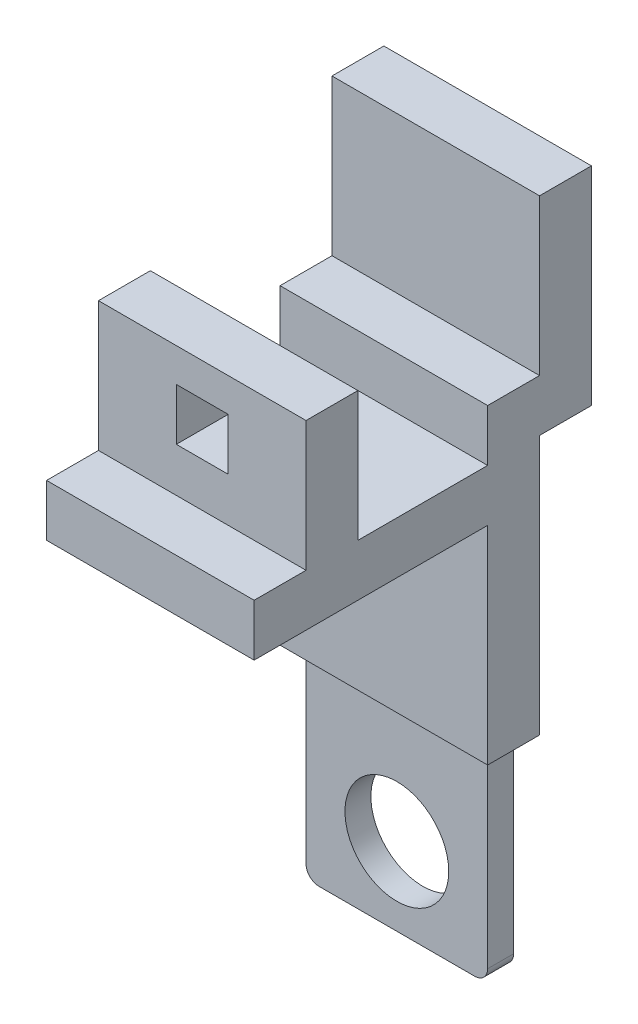
ISO-10303-21;
HEADER;
FILE_DESCRIPTION(('STEP AP214'),'2;1');
FILE_NAME('part.step','',(''),(''),'','','');
FILE_SCHEMA(('AUTOMOTIVE_DESIGN { 1 0 10303 214 1 1 1 1 }'));
ENDSEC;
DATA;
#1=APPLICATION_CONTEXT('core data for automotive mechanical design processes');
#2=APPLICATION_PROTOCOL_DEFINITION('international standard','automotive_design',2000,#1);
#3=PRODUCT_CONTEXT('',#1,'mechanical');
#4=PRODUCT('Part','Part','',(#3));
#5=PRODUCT_RELATED_PRODUCT_CATEGORY('part','',(#4));
#6=PRODUCT_DEFINITION_FORMATION('','',#4);
#7=PRODUCT_DEFINITION_CONTEXT('part definition',#1,'design');
#8=PRODUCT_DEFINITION('design','',#6,#7);
#9=PRODUCT_DEFINITION_SHAPE('','',#8);
#10=(LENGTH_UNIT() NAMED_UNIT(*) SI_UNIT(.MILLI.,.METRE.));
#11=(NAMED_UNIT(*) PLANE_ANGLE_UNIT() SI_UNIT($,.RADIAN.));
#12=(NAMED_UNIT(*) SI_UNIT($,.STERADIAN.) SOLID_ANGLE_UNIT());
#13=UNCERTAINTY_MEASURE_WITH_UNIT(LENGTH_MEASURE(1.E-05),#10,'distance_accuracy_value','');
#14=(GEOMETRIC_REPRESENTATION_CONTEXT(3) GLOBAL_UNCERTAINTY_ASSIGNED_CONTEXT((#13)) GLOBAL_UNIT_ASSIGNED_CONTEXT((#10,
#11,#12)) REPRESENTATION_CONTEXT('',''));
#15=CARTESIAN_POINT('',(0.,0.,0.));
#16=DIRECTION('',(0.,0.,1.));
#17=DIRECTION('',(1.,0.,0.));
#18=AXIS2_PLACEMENT_3D('',#15,#16,#17);
#19=CARTESIAN_POINT('',(0.,5.,0.));
#20=DIRECTION('',(0.,-1.,0.));
#21=DIRECTION('',(0.,0.,-1.));
#22=AXIS2_PLACEMENT_3D('',#19,#20,#21);
#23=PLANE('',#22);
#24=DIRECTION('',(1.,0.,0.));
#25=VECTOR('',#24,1.);
#26=CARTESIAN_POINT('',(-2.,5.,4.));
#27=LINE('',#26,#25);
#28=CARTESIAN_POINT('',(-2.,5.,4.));
#29=VERTEX_POINT('',#28);
#30=CARTESIAN_POINT('',(2.,5.,4.));
#31=VERTEX_POINT('',#30);
#32=EDGE_CURVE('E268',#29,#31,#27,.T.);
#33=ORIENTED_EDGE('',*,*,#32,.F.);
#34=DIRECTION('',(0.,0.,-1.));
#35=VECTOR('',#34,1.);
#36=CARTESIAN_POINT('',(-2.,5.,0.5));
#37=LINE('',#36,#35);
#38=CARTESIAN_POINT('',(-2.,5.,5.));
#39=VERTEX_POINT('',#38);
#40=EDGE_CURVE('E365',#39,#29,#37,.T.);
#41=ORIENTED_EDGE('',*,*,#40,.F.);
#42=DIRECTION('',(-1.,0.,0.));
#43=VECTOR('',#42,1.);
#44=CARTESIAN_POINT('',(2.,5.,5.));
#45=LINE('',#44,#43);
#46=CARTESIAN_POINT('',(2.,5.,5.));
#47=VERTEX_POINT('',#46);
#48=EDGE_CURVE('E349',#47,#39,#45,.T.);
#49=ORIENTED_EDGE('',*,*,#48,.F.);
#50=DIRECTION('',(0.,0.,-1.));
#51=VECTOR('',#50,1.);
#52=CARTESIAN_POINT('',(2.,5.,0.5));
#53=LINE('',#52,#51);
#54=EDGE_CURVE('E370',#47,#31,#53,.T.);
#55=ORIENTED_EDGE('',*,*,#54,.T.);
#56=EDGE_LOOP('',(#33,#41,#49,#55));
#57=FACE_BOUND('',#56,.T.);
#58=ADVANCED_FACE('F32',(#57),#23,.F.);
#59=DIRECTION('',(-1.,0.,0.));
#60=VECTOR('',#59,1.);
#61=CARTESIAN_POINT('',(-2.,5.,3.));
#62=LINE('',#61,#60);
#63=CARTESIAN_POINT('',(2.,5.,3.));
#64=VERTEX_POINT('',#63);
#65=CARTESIAN_POINT('',(-2.,5.,3.));
#66=VERTEX_POINT('',#65);
#67=EDGE_CURVE('E273',#64,#66,#62,.T.);
#68=ORIENTED_EDGE('',*,*,#67,.F.);
#69=CARTESIAN_POINT('',(2.,5.,0.5));
#70=VERTEX_POINT('',#69);
#71=EDGE_CURVE('E368',#64,#70,#53,.T.);
#72=ORIENTED_EDGE('',*,*,#71,.T.);
#73=DIRECTION('',(1.,0.,0.));
#74=VECTOR('',#73,1.);
#75=CARTESIAN_POINT('',(-2.,5.,0.5));
#76=LINE('',#75,#74);
#77=CARTESIAN_POINT('',(-2.,5.,0.5));
#78=VERTEX_POINT('',#77);
#79=EDGE_CURVE('E330',#78,#70,#76,.T.);
#80=ORIENTED_EDGE('',*,*,#79,.F.);
#81=EDGE_CURVE('E369',#66,#78,#37,.T.);
#82=ORIENTED_EDGE('',*,*,#81,.F.);
#83=EDGE_LOOP('',(#68,#72,#80,#82));
#84=FACE_BOUND('',#83,.T.);
#85=ADVANCED_FACE('F485',(#84),#23,.F.);
#86=CARTESIAN_POINT('',(-2.,5.,0.5));
#87=DIRECTION('',(0.,0.,-1.));
#88=DIRECTION('',(-1.,0.,0.));
#89=AXIS2_PLACEMENT_3D('',#86,#87,#88);
#90=PLANE('',#89);
#91=DIRECTION('',(1.,0.,0.));
#92=VECTOR('',#91,1.);
#93=CARTESIAN_POINT('',(2.,4.,0.5));
#94=LINE('',#93,#92);
#95=CARTESIAN_POINT('',(-2.,4.,0.5));
#96=VERTEX_POINT('',#95);
#97=CARTESIAN_POINT('',(2.,4.,0.5));
#98=VERTEX_POINT('',#97);
#99=EDGE_CURVE('E345',#96,#98,#94,.T.);
#100=ORIENTED_EDGE('',*,*,#99,.F.);
#101=DIRECTION('',(0.,-1.,0.));
#102=VECTOR('',#101,1.);
#103=CARTESIAN_POINT('',(-2.,5.,0.5));
#104=LINE('',#103,#102);
#105=CARTESIAN_POINT('',(-2.,0.,0.5));
#106=VERTEX_POINT('',#105);
#107=EDGE_CURVE('E384',#96,#106,#104,.T.);
#108=ORIENTED_EDGE('',*,*,#107,.T.);
#109=DIRECTION('',(1.,0.,0.));
#110=VECTOR('',#109,1.);
#111=CARTESIAN_POINT('',(-2.,0.,0.5));
#112=LINE('',#111,#110);
#113=CARTESIAN_POINT('',(2.,0.,0.5));
#114=VERTEX_POINT('',#113);
#115=EDGE_CURVE('E381',#106,#114,#112,.T.);
#116=ORIENTED_EDGE('',*,*,#115,.T.);
#117=DIRECTION('',(0.,-1.,0.));
#118=VECTOR('',#117,1.);
#119=CARTESIAN_POINT('',(2.,5.,0.5));
#120=LINE('',#119,#118);
#121=EDGE_CURVE('E387',#98,#114,#120,.T.);
#122=ORIENTED_EDGE('',*,*,#121,.F.);
#123=EDGE_LOOP('',(#100,#108,#116,#122));
#124=FACE_BOUND('',#123,.T.);
#125=ADVANCED_FACE('F491',(#124),#90,.F.);
#126=CARTESIAN_POINT('',(-2.,5.,0.5));
#127=DIRECTION('',(-1.,0.,0.));
#128=DIRECTION('',(0.,0.,1.));
#129=AXIS2_PLACEMENT_3D('',#126,#127,#128);
#130=PLANE('',#129);
#131=DIRECTION('',(0.,0.,-1.));
#132=VECTOR('',#131,1.);
#133=CARTESIAN_POINT('',(-2.,0.,0.5));
#134=LINE('',#133,#132);
#135=CARTESIAN_POINT('',(-2.,0.,-0.5));
#136=VERTEX_POINT('',#135);
#137=EDGE_CURVE('E364',#106,#136,#134,.T.);
#138=ORIENTED_EDGE('',*,*,#137,.F.);
#139=ORIENTED_EDGE('',*,*,#107,.F.);
#140=DIRECTION('',(0.,0.,-1.));
#141=VECTOR('',#140,1.);
#142=CARTESIAN_POINT('',(-2.,4.,5.));
#143=LINE('',#142,#141);
#144=CARTESIAN_POINT('',(-2.,4.,5.));
#145=VERTEX_POINT('',#144);
#146=EDGE_CURVE('E361',#145,#96,#143,.T.);
#147=ORIENTED_EDGE('',*,*,#146,.F.);
#148=DIRECTION('',(0.,-1.,0.));
#149=VECTOR('',#148,1.);
#150=CARTESIAN_POINT('',(-2.,5.,5.));
#151=LINE('',#150,#149);
#152=EDGE_CURVE('E352',#39,#145,#151,.T.);
#153=ORIENTED_EDGE('',*,*,#152,.F.);
#154=ORIENTED_EDGE('',*,*,#40,.T.);
#155=DIRECTION('',(0.,-1.,0.));
#156=VECTOR('',#155,1.);
#157=CARTESIAN_POINT('',(-2.,7.5,4.));
#158=LINE('',#157,#156);
#159=CARTESIAN_POINT('',(-2.,7.5,4.));
#160=VERTEX_POINT('',#159);
#161=EDGE_CURVE('E292',#160,#29,#158,.T.);
#162=ORIENTED_EDGE('',*,*,#161,.F.);
#163=DIRECTION('',(0.,0.,1.));
#164=VECTOR('',#163,1.);
#165=CARTESIAN_POINT('',(-2.,7.5,4.));
#166=LINE('',#165,#164);
#167=CARTESIAN_POINT('',(-2.,7.5,3.));
#168=VERTEX_POINT('',#167);
#169=EDGE_CURVE('E269',#168,#160,#166,.T.);
#170=ORIENTED_EDGE('',*,*,#169,.F.);
#171=DIRECTION('',(0.,-1.,0.));
#172=VECTOR('',#171,1.);
#173=CARTESIAN_POINT('',(-2.,7.5,3.));
#174=LINE('',#173,#172);
#175=EDGE_CURVE('E279',#168,#66,#174,.T.);
#176=ORIENTED_EDGE('',*,*,#175,.T.);
#177=ORIENTED_EDGE('',*,*,#81,.T.);
#178=DIRECTION('',(0.,-1.,0.));
#179=VECTOR('',#178,1.);
#180=CARTESIAN_POINT('',(-2.,6.,0.5));
#181=LINE('',#180,#179);
#182=CARTESIAN_POINT('',(-2.,6.,0.5));
#183=VERTEX_POINT('',#182);
#184=EDGE_CURVE('E342',#183,#78,#181,.T.);
#185=ORIENTED_EDGE('',*,*,#184,.F.);
#186=DIRECTION('',(0.,0.,1.));
#187=VECTOR('',#186,1.);
#188=CARTESIAN_POINT('',(-2.,6.,-0.5));
#189=LINE('',#188,#187);
#190=CARTESIAN_POINT('',(-2.,6.,-0.5));
#191=VERTEX_POINT('',#190);
#192=EDGE_CURVE('E331',#191,#183,#189,.T.);
#193=ORIENTED_EDGE('',*,*,#192,.F.);
#194=DIRECTION('',(0.,-1.,0.));
#195=VECTOR('',#194,1.);
#196=CARTESIAN_POINT('',(-2.,9.,-0.5));
#197=LINE('',#196,#195);
#198=CARTESIAN_POINT('',(-2.,9.,-0.5));
#199=VERTEX_POINT('',#198);
#200=EDGE_CURVE('E312',#199,#191,#197,.T.);
#201=ORIENTED_EDGE('',*,*,#200,.F.);
#202=DIRECTION('',(0.,0.,1.));
#203=VECTOR('',#202,1.);
#204=CARTESIAN_POINT('',(-2.,9.,-1.5));
#205=LINE('',#204,#203);
#206=CARTESIAN_POINT('',(-2.,9.,-1.5));
#207=VERTEX_POINT('',#206);
#208=EDGE_CURVE('E296',#207,#199,#205,.T.);
#209=ORIENTED_EDGE('',*,*,#208,.F.);
#210=DIRECTION('',(0.,1.,0.));
#211=VECTOR('',#210,1.);
#212=CARTESIAN_POINT('',(-2.,6.,-1.5));
#213=LINE('',#212,#211);
#214=CARTESIAN_POINT('',(-2.,5.,-1.5));
#215=VERTEX_POINT('',#214);
#216=EDGE_CURVE('E316',#215,#207,#213,.T.);
#217=ORIENTED_EDGE('',*,*,#216,.F.);
#218=DIRECTION('',(0.,0.,1.));
#219=VECTOR('',#218,1.);
#220=CARTESIAN_POINT('',(-2.,5.,-1.5));
#221=LINE('',#220,#219);
#222=CARTESIAN_POINT('',(-2.,5.,-0.5));
#223=VERTEX_POINT('',#222);
#224=EDGE_CURVE('E322',#215,#223,#221,.T.);
#225=ORIENTED_EDGE('',*,*,#224,.T.);
#226=DIRECTION('',(0.,-1.,0.));
#227=VECTOR('',#226,1.);
#228=CARTESIAN_POINT('',(-2.,5.,-0.5));
#229=LINE('',#228,#227);
#230=EDGE_CURVE('E372',#223,#136,#229,.T.);
#231=ORIENTED_EDGE('',*,*,#230,.T.);
#232=EDGE_LOOP('',(#138,#139,#147,#153,#154,#162,#170,#176,#177,#185,#193,#201,#209,#217,#225,#231));
#233=FACE_BOUND('',#232,.T.);
#234=ADVANCED_FACE('F436',(#233),#130,.T.);
#235=CARTESIAN_POINT('',(2.,5.,0.5));
#236=DIRECTION('',(-1.,0.,0.));
#237=DIRECTION('',(0.,0.,1.));
#238=AXIS2_PLACEMENT_3D('',#235,#236,#237);
#239=PLANE('',#238);
#240=DIRECTION('',(0.,0.,-1.));
#241=VECTOR('',#240,1.);
#242=CARTESIAN_POINT('',(2.,0.,0.5));
#243=LINE('',#242,#241);
#244=CARTESIAN_POINT('',(2.,0.,-0.5));
#245=VERTEX_POINT('',#244);
#246=EDGE_CURVE('E378',#114,#245,#243,.T.);
#247=ORIENTED_EDGE('',*,*,#246,.T.);
#248=DIRECTION('',(0.,-1.,0.));
#249=VECTOR('',#248,1.);
#250=CARTESIAN_POINT('',(2.,5.,-0.5));
#251=LINE('',#250,#249);
#252=CARTESIAN_POINT('',(2.,5.,-0.5));
#253=VERTEX_POINT('',#252);
#254=EDGE_CURVE('E389',#253,#245,#251,.T.);
#255=ORIENTED_EDGE('',*,*,#254,.F.);
#256=DIRECTION('',(0.,0.,1.));
#257=VECTOR('',#256,1.);
#258=CARTESIAN_POINT('',(2.,5.,-1.5));
#259=LINE('',#258,#257);
#260=CARTESIAN_POINT('',(2.,5.,-1.5));
#261=VERTEX_POINT('',#260);
#262=EDGE_CURVE('E327',#261,#253,#259,.T.);
#263=ORIENTED_EDGE('',*,*,#262,.F.);
#264=DIRECTION('',(0.,-1.,0.));
#265=VECTOR('',#264,1.);
#266=CARTESIAN_POINT('',(2.,6.,-1.5));
#267=LINE('',#266,#265);
#268=CARTESIAN_POINT('',(2.,9.,-1.5));
#269=VERTEX_POINT('',#268);
#270=EDGE_CURVE('E318',#269,#261,#267,.T.);
#271=ORIENTED_EDGE('',*,*,#270,.F.);
#272=DIRECTION('',(0.,0.,-1.));
#273=VECTOR('',#272,1.);
#274=CARTESIAN_POINT('',(2.,9.,-1.5));
#275=LINE('',#274,#273);
#276=CARTESIAN_POINT('',(2.,9.,-0.5));
#277=VERTEX_POINT('',#276);
#278=EDGE_CURVE('E301',#277,#269,#275,.T.);
#279=ORIENTED_EDGE('',*,*,#278,.F.);
#280=DIRECTION('',(0.,-1.,0.));
#281=VECTOR('',#280,1.);
#282=CARTESIAN_POINT('',(2.,9.,-0.5));
#283=LINE('',#282,#281);
#284=CARTESIAN_POINT('',(2.,6.,-0.5));
#285=VERTEX_POINT('',#284);
#286=EDGE_CURVE('E307',#277,#285,#283,.T.);
#287=ORIENTED_EDGE('',*,*,#286,.T.);
#288=DIRECTION('',(0.,0.,-1.));
#289=VECTOR('',#288,1.);
#290=CARTESIAN_POINT('',(2.,6.,-0.5));
#291=LINE('',#290,#289);
#292=CARTESIAN_POINT('',(2.,6.,0.5));
#293=VERTEX_POINT('',#292);
#294=EDGE_CURVE('E335',#293,#285,#291,.T.);
#295=ORIENTED_EDGE('',*,*,#294,.F.);
#296=DIRECTION('',(0.,-1.,0.));
#297=VECTOR('',#296,1.);
#298=CARTESIAN_POINT('',(2.,6.,0.5));
#299=LINE('',#298,#297);
#300=EDGE_CURVE('E337',#293,#70,#299,.T.);
#301=ORIENTED_EDGE('',*,*,#300,.T.);
#302=ORIENTED_EDGE('',*,*,#71,.F.);
#303=DIRECTION('',(0.,-1.,0.));
#304=VECTOR('',#303,1.);
#305=CARTESIAN_POINT('',(2.,7.5,3.));
#306=LINE('',#305,#304);
#307=CARTESIAN_POINT('',(2.,7.5,3.));
#308=VERTEX_POINT('',#307);
#309=EDGE_CURVE('E286',#308,#64,#306,.T.);
#310=ORIENTED_EDGE('',*,*,#309,.F.);
#311=DIRECTION('',(0.,0.,-1.));
#312=VECTOR('',#311,1.);
#313=CARTESIAN_POINT('',(2.,7.5,4.));
#314=LINE('',#313,#312);
#315=CARTESIAN_POINT('',(2.,7.5,4.));
#316=VERTEX_POINT('',#315);
#317=EDGE_CURVE('E275',#316,#308,#314,.T.);
#318=ORIENTED_EDGE('',*,*,#317,.F.);
#319=DIRECTION('',(0.,-1.,0.));
#320=VECTOR('',#319,1.);
#321=CARTESIAN_POINT('',(2.,7.5,4.));
#322=LINE('',#321,#320);
#323=EDGE_CURVE('E289',#316,#31,#322,.T.);
#324=ORIENTED_EDGE('',*,*,#323,.T.);
#325=ORIENTED_EDGE('',*,*,#54,.F.);
#326=DIRECTION('',(0.,1.,0.));
#327=VECTOR('',#326,1.);
#328=CARTESIAN_POINT('',(2.,5.,5.));
#329=LINE('',#328,#327);
#330=CARTESIAN_POINT('',(2.,4.,5.));
#331=VERTEX_POINT('',#330);
#332=EDGE_CURVE('E346',#331,#47,#329,.T.);
#333=ORIENTED_EDGE('',*,*,#332,.F.);
#334=DIRECTION('',(0.,0.,-1.));
#335=VECTOR('',#334,1.);
#336=CARTESIAN_POINT('',(2.,4.,5.));
#337=LINE('',#336,#335);
#338=EDGE_CURVE('E356',#331,#98,#337,.T.);
#339=ORIENTED_EDGE('',*,*,#338,.T.);
#340=ORIENTED_EDGE('',*,*,#121,.T.);
#341=EDGE_LOOP('',(#247,#255,#263,#271,#279,#287,#295,#301,#302,#310,#318,#324,#325,#333,#339,#340));
#342=FACE_BOUND('',#341,.T.);
#343=ADVANCED_FACE('F446',(#342),#239,.F.);
#344=CARTESIAN_POINT('',(-2.,5.,-0.5));
#345=DIRECTION('',(0.,0.,-1.));
#346=DIRECTION('',(-1.,0.,0.));
#347=AXIS2_PLACEMENT_3D('',#344,#345,#346);
#348=PLANE('',#347);
#349=DIRECTION('',(-1.,0.,0.));
#350=VECTOR('',#349,1.);
#351=CARTESIAN_POINT('',(-2.,5.,-0.5));
#352=LINE('',#351,#350);
#353=EDGE_CURVE('E315',#253,#223,#352,.T.);
#354=ORIENTED_EDGE('',*,*,#353,.F.);
#355=ORIENTED_EDGE('',*,*,#254,.T.);
#356=DIRECTION('',(1.,0.,0.));
#357=VECTOR('',#356,1.);
#358=CARTESIAN_POINT('',(-2.,0.,-0.5));
#359=LINE('',#358,#357);
#360=EDGE_CURVE('E375',#136,#245,#359,.T.);
#361=ORIENTED_EDGE('',*,*,#360,.F.);
#362=ORIENTED_EDGE('',*,*,#230,.F.);
#363=EDGE_LOOP('',(#354,#355,#361,#362));
#364=FACE_BOUND('',#363,.T.);
#365=ADVANCED_FACE('F441',(#364),#348,.T.);
#366=CARTESIAN_POINT('',(2.,4.,5.));
#367=DIRECTION('',(0.,1.,0.));
#368=DIRECTION('',(0.,0.,1.));
#369=AXIS2_PLACEMENT_3D('',#366,#367,#368);
#370=PLANE('',#369);
#371=ORIENTED_EDGE('',*,*,#99,.T.);
#372=ORIENTED_EDGE('',*,*,#338,.F.);
#373=DIRECTION('',(1.,0.,0.));
#374=VECTOR('',#373,1.);
#375=CARTESIAN_POINT('',(2.,4.,5.));
#376=LINE('',#375,#374);
#377=EDGE_CURVE('E354',#145,#331,#376,.T.);
#378=ORIENTED_EDGE('',*,*,#377,.F.);
#379=ORIENTED_EDGE('',*,*,#146,.T.);
#380=EDGE_LOOP('',(#371,#372,#378,#379));
#381=FACE_BOUND('',#380,.T.);
#382=ADVANCED_FACE('F495',(#381),#370,.F.);
#383=CARTESIAN_POINT('',(0.,0.,5.));
#384=DIRECTION('',(0.,0.,-1.));
#385=DIRECTION('',(-1.,0.,0.));
#386=AXIS2_PLACEMENT_3D('',#383,#384,#385);
#387=PLANE('',#386);
#388=ORIENTED_EDGE('',*,*,#332,.T.);
#389=ORIENTED_EDGE('',*,*,#48,.T.);
#390=ORIENTED_EDGE('',*,*,#152,.T.);
#391=ORIENTED_EDGE('',*,*,#377,.T.);
#392=EDGE_LOOP('',(#388,#389,#390,#391));
#393=FACE_BOUND('',#392,.T.);
#394=ADVANCED_FACE('F568',(#393),#387,.F.);
#395=CARTESIAN_POINT('',(-2.,6.,0.5));
#396=DIRECTION('',(0.,0.,-1.));
#397=DIRECTION('',(-1.,0.,0.));
#398=AXIS2_PLACEMENT_3D('',#395,#396,#397);
#399=PLANE('',#398);
#400=ORIENTED_EDGE('',*,*,#79,.T.);
#401=ORIENTED_EDGE('',*,*,#300,.F.);
#402=DIRECTION('',(1.,0.,0.));
#403=VECTOR('',#402,1.);
#404=CARTESIAN_POINT('',(-2.,6.,0.5));
#405=LINE('',#404,#403);
#406=EDGE_CURVE('E333',#183,#293,#405,.T.);
#407=ORIENTED_EDGE('',*,*,#406,.F.);
#408=ORIENTED_EDGE('',*,*,#184,.T.);
#409=EDGE_LOOP('',(#400,#401,#407,#408));
#410=FACE_BOUND('',#409,.T.);
#411=ADVANCED_FACE('F565',(#410),#399,.F.);
#412=CARTESIAN_POINT('',(0.,6.,0.));
#413=DIRECTION('',(0.,1.,0.));
#414=DIRECTION('',(0.,0.,1.));
#415=AXIS2_PLACEMENT_3D('',#412,#413,#414);
#416=PLANE('',#415);
#417=DIRECTION('',(1.,0.,0.));
#418=VECTOR('',#417,1.);
#419=CARTESIAN_POINT('',(-2.,6.,-0.5));
#420=LINE('',#419,#418);
#421=EDGE_CURVE('E295',#191,#285,#420,.T.);
#422=ORIENTED_EDGE('',*,*,#421,.F.);
#423=ORIENTED_EDGE('',*,*,#192,.T.);
#424=ORIENTED_EDGE('',*,*,#406,.T.);
#425=ORIENTED_EDGE('',*,*,#294,.T.);
#426=EDGE_LOOP('',(#422,#423,#424,#425));
#427=FACE_BOUND('',#426,.T.);
#428=ADVANCED_FACE('F561',(#427),#416,.T.);
#429=CARTESIAN_POINT('',(-2.,5.,-1.5));
#430=DIRECTION('',(0.,1.,0.));
#431=DIRECTION('',(0.,0.,1.));
#432=AXIS2_PLACEMENT_3D('',#429,#430,#431);
#433=PLANE('',#432);
#434=ORIENTED_EDGE('',*,*,#353,.T.);
#435=ORIENTED_EDGE('',*,*,#224,.F.);
#436=DIRECTION('',(-1.,0.,0.));
#437=VECTOR('',#436,1.);
#438=CARTESIAN_POINT('',(-2.,5.,-1.5));
#439=LINE('',#438,#437);
#440=EDGE_CURVE('E320',#261,#215,#439,.T.);
#441=ORIENTED_EDGE('',*,*,#440,.F.);
#442=ORIENTED_EDGE('',*,*,#262,.T.);
#443=EDGE_LOOP('',(#434,#435,#441,#442));
#444=FACE_BOUND('',#443,.T.);
#445=ADVANCED_FACE('F557',(#444),#433,.F.);
#446=CARTESIAN_POINT('',(0.,0.,-1.5));
#447=DIRECTION('',(0.,0.,1.));
#448=DIRECTION('',(1.,0.,0.));
#449=AXIS2_PLACEMENT_3D('',#446,#447,#448);
#450=PLANE('',#449);
#451=ORIENTED_EDGE('',*,*,#216,.T.);
#452=DIRECTION('',(-1.,0.,0.));
#453=VECTOR('',#452,1.);
#454=CARTESIAN_POINT('',(-2.,9.,-1.5));
#455=LINE('',#454,#453);
#456=EDGE_CURVE('E304',#269,#207,#455,.T.);
#457=ORIENTED_EDGE('',*,*,#456,.F.);
#458=ORIENTED_EDGE('',*,*,#270,.T.);
#459=ORIENTED_EDGE('',*,*,#440,.T.);
#460=EDGE_LOOP('',(#451,#457,#458,#459));
#461=FACE_BOUND('',#460,.T.);
#462=ADVANCED_FACE('F553',(#461),#450,.F.);
#463=CARTESIAN_POINT('',(-2.,9.,-0.5));
#464=DIRECTION('',(0.,0.,-1.));
#465=DIRECTION('',(-1.,0.,0.));
#466=AXIS2_PLACEMENT_3D('',#463,#464,#465);
#467=PLANE('',#466);
#468=ORIENTED_EDGE('',*,*,#421,.T.);
#469=ORIENTED_EDGE('',*,*,#286,.F.);
#470=DIRECTION('',(1.,0.,0.));
#471=VECTOR('',#470,1.);
#472=CARTESIAN_POINT('',(-2.,9.,-0.5));
#473=LINE('',#472,#471);
#474=EDGE_CURVE('E299',#199,#277,#473,.T.);
#475=ORIENTED_EDGE('',*,*,#474,.F.);
#476=ORIENTED_EDGE('',*,*,#200,.T.);
#477=EDGE_LOOP('',(#468,#469,#475,#476));
#478=FACE_BOUND('',#477,.T.);
#479=ADVANCED_FACE('F549',(#478),#467,.F.);
#480=CARTESIAN_POINT('',(0.,9.,0.));
#481=DIRECTION('',(0.,1.,0.));
#482=DIRECTION('',(0.,0.,1.));
#483=AXIS2_PLACEMENT_3D('',#480,#481,#482);
#484=PLANE('',#483);
#485=ORIENTED_EDGE('',*,*,#208,.T.);
#486=ORIENTED_EDGE('',*,*,#474,.T.);
#487=ORIENTED_EDGE('',*,*,#278,.T.);
#488=ORIENTED_EDGE('',*,*,#456,.T.);
#489=EDGE_LOOP('',(#485,#486,#487,#488));
#490=FACE_BOUND('',#489,.T.);
#491=ADVANCED_FACE('F545',(#490),#484,.T.);
#492=CARTESIAN_POINT('',(-2.,7.5,4.));
#493=DIRECTION('',(0.,0.,-1.));
#494=DIRECTION('',(-1.,0.,0.));
#495=AXIS2_PLACEMENT_3D('',#492,#493,#494);
#496=PLANE('',#495);
#497=DIRECTION('',(-1.,0.,0.));
#498=VECTOR('',#497,1.);
#499=CARTESIAN_POINT('',(-0.5,6.85222348054572,4.));
#500=LINE('',#499,#498);
#501=CARTESIAN_POINT('',(0.5,6.85222348054572,4.));
#502=VERTEX_POINT('',#501);
#503=CARTESIAN_POINT('',(-0.5,6.85222348054572,4.));
#504=VERTEX_POINT('',#503);
#505=EDGE_CURVE('E234',#502,#504,#500,.T.);
#506=ORIENTED_EDGE('',*,*,#505,.F.);
#507=DIRECTION('',(0.,1.,0.));
#508=VECTOR('',#507,1.);
#509=CARTESIAN_POINT('',(0.5,5.85222348054573,4.));
#510=LINE('',#509,#508);
#511=CARTESIAN_POINT('',(0.5,5.85222348054573,4.));
#512=VERTEX_POINT('',#511);
#513=EDGE_CURVE('E49',#512,#502,#510,.T.);
#514=ORIENTED_EDGE('',*,*,#513,.F.);
#515=DIRECTION('',(1.,0.,0.));
#516=VECTOR('',#515,1.);
#517=CARTESIAN_POINT('',(-0.5,5.85222348054572,4.));
#518=LINE('',#517,#516);
#519=CARTESIAN_POINT('',(-0.5,5.85222348054572,4.));
#520=VERTEX_POINT('',#519);
#521=EDGE_CURVE('E225',#520,#512,#518,.T.);
#522=ORIENTED_EDGE('',*,*,#521,.F.);
#523=DIRECTION('',(0.,-1.,0.));
#524=VECTOR('',#523,1.);
#525=CARTESIAN_POINT('',(-0.5,5.85222348054572,4.));
#526=LINE('',#525,#524);
#527=EDGE_CURVE('E228',#504,#520,#526,.T.);
#528=ORIENTED_EDGE('',*,*,#527,.F.);
#529=EDGE_LOOP('',(#506,#514,#522,#528));
#530=FACE_BOUND('',#529,.T.);
#531=ORIENTED_EDGE('',*,*,#32,.T.);
#532=ORIENTED_EDGE('',*,*,#323,.F.);
#533=DIRECTION('',(1.,0.,0.));
#534=VECTOR('',#533,1.);
#535=CARTESIAN_POINT('',(-2.,7.5,4.));
#536=LINE('',#535,#534);
#537=EDGE_CURVE('E272',#160,#316,#536,.T.);
#538=ORIENTED_EDGE('',*,*,#537,.F.);
#539=ORIENTED_EDGE('',*,*,#161,.T.);
#540=EDGE_LOOP('',(#531,#532,#538,#539));
#541=FACE_BOUND('',#540,.T.);
#542=ADVANCED_FACE('F542',(#530,#541),#496,.F.);
#543=CARTESIAN_POINT('',(-2.,7.5,3.));
#544=DIRECTION('',(0.,0.,1.));
#545=DIRECTION('',(1.,0.,0.));
#546=AXIS2_PLACEMENT_3D('',#543,#544,#545);
#547=PLANE('',#546);
#548=DIRECTION('',(1.,0.,0.));
#549=VECTOR('',#548,1.);
#550=CARTESIAN_POINT('',(-0.5,5.85222348054572,3.));
#551=LINE('',#550,#549);
#552=CARTESIAN_POINT('',(-0.5,5.85222348054572,3.));
#553=VERTEX_POINT('',#552);
#554=CARTESIAN_POINT('',(0.5,5.85222348054573,3.));
#555=VERTEX_POINT('',#554);
#556=EDGE_CURVE('E215',#553,#555,#551,.T.);
#557=ORIENTED_EDGE('',*,*,#556,.T.);
#558=DIRECTION('',(0.,1.,0.));
#559=VECTOR('',#558,1.);
#560=CARTESIAN_POINT('',(0.5,5.85222348054573,3.));
#561=LINE('',#560,#559);
#562=CARTESIAN_POINT('',(0.5,6.85222348054572,3.));
#563=VERTEX_POINT('',#562);
#564=EDGE_CURVE('E209',#555,#563,#561,.T.);
#565=ORIENTED_EDGE('',*,*,#564,.T.);
#566=DIRECTION('',(-1.,0.,0.));
#567=VECTOR('',#566,1.);
#568=CARTESIAN_POINT('',(-0.5,6.85222348054572,3.));
#569=LINE('',#568,#567);
#570=CARTESIAN_POINT('',(-0.500000000000001,6.85222348054572,3.));
#571=VERTEX_POINT('',#570);
#572=EDGE_CURVE('E218',#563,#571,#569,.T.);
#573=ORIENTED_EDGE('',*,*,#572,.T.);
#574=DIRECTION('',(0.,-1.,0.));
#575=VECTOR('',#574,1.);
#576=CARTESIAN_POINT('',(-0.5,5.85222348054572,3.));
#577=LINE('',#576,#575);
#578=EDGE_CURVE('E57',#571,#553,#577,.T.);
#579=ORIENTED_EDGE('',*,*,#578,.T.);
#580=EDGE_LOOP('',(#557,#565,#573,#579));
#581=FACE_BOUND('',#580,.T.);
#582=ORIENTED_EDGE('',*,*,#67,.T.);
#583=ORIENTED_EDGE('',*,*,#175,.F.);
#584=DIRECTION('',(-1.,0.,0.));
#585=VECTOR('',#584,1.);
#586=CARTESIAN_POINT('',(-2.,7.5,3.));
#587=LINE('',#586,#585);
#588=EDGE_CURVE('E277',#308,#168,#587,.T.);
#589=ORIENTED_EDGE('',*,*,#588,.F.);
#590=ORIENTED_EDGE('',*,*,#309,.T.);
#591=EDGE_LOOP('',(#582,#583,#589,#590));
#592=FACE_BOUND('',#591,.T.);
#593=ADVANCED_FACE('F222',(#581,#592),#547,.F.);
#594=CARTESIAN_POINT('',(0.,7.5,0.));
#595=DIRECTION('',(0.,-1.,0.));
#596=DIRECTION('',(0.,0.,-1.));
#597=AXIS2_PLACEMENT_3D('',#594,#595,#596);
#598=PLANE('',#597);
#599=ORIENTED_EDGE('',*,*,#169,.T.);
#600=ORIENTED_EDGE('',*,*,#537,.T.);
#601=ORIENTED_EDGE('',*,*,#317,.T.);
#602=ORIENTED_EDGE('',*,*,#588,.T.);
#603=EDGE_LOOP('',(#599,#600,#601,#602));
#604=FACE_BOUND('',#603,.T.);
#605=ADVANCED_FACE('F536',(#604),#598,.F.);
#606=CARTESIAN_POINT('',(-1.75,-3.9,-0.25));
#607=DIRECTION('',(1.,0.,0.));
#608=DIRECTION('',(0.,0.,-1.));
#609=AXIS2_PLACEMENT_3D('',#606,#607,#608);
#610=PLANE('',#609);
#611=DIRECTION('',(0.,1.,0.));
#612=VECTOR('',#611,1.);
#613=CARTESIAN_POINT('',(-1.75,-3.9,0.25));
#614=LINE('',#613,#612);
#615=CARTESIAN_POINT('',(-1.75,-3.65,0.25));
#616=VERTEX_POINT('',#615);
#617=CARTESIAN_POINT('',(-1.75,-0.25,0.25));
#618=VERTEX_POINT('',#617);
#619=EDGE_CURVE('E256',#616,#618,#614,.T.);
#620=ORIENTED_EDGE('',*,*,#619,.T.);
#621=DIRECTION('',(0.,0.,-1.));
#622=VECTOR('',#621,1.);
#623=CARTESIAN_POINT('',(-1.75,-0.25,-0.25));
#624=LINE('',#623,#622);
#625=CARTESIAN_POINT('',(-1.75,-0.25,-0.25));
#626=VERTEX_POINT('',#625);
#627=EDGE_CURVE('E405',#618,#626,#624,.T.);
#628=ORIENTED_EDGE('',*,*,#627,.T.);
#629=DIRECTION('',(0.,1.,0.));
#630=VECTOR('',#629,1.);
#631=CARTESIAN_POINT('',(-1.75,-3.9,-0.25));
#632=LINE('',#631,#630);
#633=CARTESIAN_POINT('',(-1.75,-3.65,-0.25));
#634=VERTEX_POINT('',#633);
#635=EDGE_CURVE('E265',#634,#626,#632,.T.);
#636=ORIENTED_EDGE('',*,*,#635,.F.);
#637=DIRECTION('',(0.,0.,-1.));
#638=VECTOR('',#637,1.);
#639=CARTESIAN_POINT('',(-1.75,-3.65,0.25));
#640=LINE('',#639,#638);
#641=EDGE_CURVE('E403',#634,#616,#640,.F.);
#642=ORIENTED_EDGE('',*,*,#641,.T.);
#643=EDGE_LOOP('',(#620,#628,#636,#642));
#644=FACE_BOUND('',#643,.T.);
#645=ADVANCED_FACE('F474',(#644),#610,.F.);
#646=CARTESIAN_POINT('',(1.75,-3.9,-0.25));
#647=DIRECTION('',(0.,0.,1.));
#648=DIRECTION('',(1.,0.,0.));
#649=AXIS2_PLACEMENT_3D('',#646,#647,#648);
#650=PLANE('',#649);
#651=CARTESIAN_POINT('',(0.,-2.4,-0.25));
#652=DIRECTION('',(0.,0.,1.));
#653=DIRECTION('',(1.,0.,0.));
#654=AXIS2_PLACEMENT_3D('',#651,#652,#653);
#655=CIRCLE('',#654,1.);
#656=CARTESIAN_POINT('',(1.,-2.4,-0.25));
#657=VERTEX_POINT('',#656);
#658=EDGE_CURVE('E247',#657,#657,#655,.T.);
#659=ORIENTED_EDGE('',*,*,#658,.T.);
#660=EDGE_LOOP('',(#659));
#661=FACE_BOUND('',#660,.T.);
#662=ORIENTED_EDGE('',*,*,#635,.T.);
#663=DIRECTION('',(1.,0.,0.));
#664=VECTOR('',#663,1.);
#665=CARTESIAN_POINT('',(1.75,-0.25,-0.25));
#666=LINE('',#665,#664);
#667=CARTESIAN_POINT('',(1.75,-0.25,-0.25));
#668=VERTEX_POINT('',#667);
#669=EDGE_CURVE('E401',#626,#668,#666,.T.);
#670=ORIENTED_EDGE('',*,*,#669,.T.);
#671=DIRECTION('',(0.,1.,0.));
#672=VECTOR('',#671,1.);
#673=CARTESIAN_POINT('',(1.75,-3.9,-0.25));
#674=LINE('',#673,#672);
#675=CARTESIAN_POINT('',(1.75,-3.65,-0.25));
#676=VERTEX_POINT('',#675);
#677=EDGE_CURVE('E262',#676,#668,#674,.T.);
#678=ORIENTED_EDGE('',*,*,#677,.F.);
#679=CARTESIAN_POINT('',(1.5,-3.65,-0.25));
#680=DIRECTION('',(0.,0.,1.));
#681=DIRECTION('',(1.,0.,0.));
#682=AXIS2_PLACEMENT_3D('',#679,#680,#681);
#683=CIRCLE('',#682,0.25);
#684=CARTESIAN_POINT('',(1.5,-3.9,-0.25));
#685=VERTEX_POINT('',#684);
#686=EDGE_CURVE('E399',#676,#685,#683,.F.);
#687=ORIENTED_EDGE('',*,*,#686,.T.);
#688=DIRECTION('',(1.,0.,0.));
#689=VECTOR('',#688,1.);
#690=CARTESIAN_POINT('',(1.75,-3.9,-0.25));
#691=LINE('',#690,#689);
#692=CARTESIAN_POINT('',(-1.5,-3.9,-0.25));
#693=VERTEX_POINT('',#692);
#694=EDGE_CURVE('E250',#693,#685,#691,.T.);
#695=ORIENTED_EDGE('',*,*,#694,.F.);
#696=CARTESIAN_POINT('',(-1.5,-3.65,-0.25));
#697=DIRECTION('',(0.,0.,1.));
#698=DIRECTION('',(1.,0.,0.));
#699=AXIS2_PLACEMENT_3D('',#696,#697,#698);
#700=CIRCLE('',#699,0.25);
#701=EDGE_CURVE('E397',#693,#634,#700,.F.);
#702=ORIENTED_EDGE('',*,*,#701,.T.);
#703=EDGE_LOOP('',(#662,#670,#678,#687,#695,#702));
#704=FACE_BOUND('',#703,.T.);
#705=ADVANCED_FACE('F470',(#661,#704),#650,.F.);
#706=CARTESIAN_POINT('',(1.75,-3.9,-0.25));
#707=DIRECTION('',(-1.,0.,0.));
#708=DIRECTION('',(0.,0.,1.));
#709=AXIS2_PLACEMENT_3D('',#706,#707,#708);
#710=PLANE('',#709);
#711=ORIENTED_EDGE('',*,*,#677,.T.);
#712=DIRECTION('',(0.,0.,1.));
#713=VECTOR('',#712,1.);
#714=CARTESIAN_POINT('',(1.75,-0.25,-0.25));
#715=LINE('',#714,#713);
#716=CARTESIAN_POINT('',(1.75,-0.25,0.25));
#717=VERTEX_POINT('',#716);
#718=EDGE_CURVE('E394',#668,#717,#715,.T.);
#719=ORIENTED_EDGE('',*,*,#718,.T.);
#720=DIRECTION('',(0.,1.,0.));
#721=VECTOR('',#720,1.);
#722=CARTESIAN_POINT('',(1.75,-3.9,0.25));
#723=LINE('',#722,#721);
#724=CARTESIAN_POINT('',(1.75,-3.65,0.25));
#725=VERTEX_POINT('',#724);
#726=EDGE_CURVE('E259',#725,#717,#723,.T.);
#727=ORIENTED_EDGE('',*,*,#726,.F.);
#728=DIRECTION('',(0.,0.,1.));
#729=VECTOR('',#728,1.);
#730=CARTESIAN_POINT('',(1.75,-3.65,-0.25));
#731=LINE('',#730,#729);
#732=EDGE_CURVE('E386',#725,#676,#731,.F.);
#733=ORIENTED_EDGE('',*,*,#732,.T.);
#734=EDGE_LOOP('',(#711,#719,#727,#733));
#735=FACE_BOUND('',#734,.T.);
#736=ADVANCED_FACE('F456',(#735),#710,.F.);
#737=CARTESIAN_POINT('',(1.75,-3.9,0.25));
#738=DIRECTION('',(0.,0.,-1.));
#739=DIRECTION('',(-1.,0.,0.));
#740=AXIS2_PLACEMENT_3D('',#737,#738,#739);
#741=PLANE('',#740);
#742=CARTESIAN_POINT('',(0.,-2.4,0.25));
#743=DIRECTION('',(0.,0.,1.));
#744=DIRECTION('',(1.,0.,0.));
#745=AXIS2_PLACEMENT_3D('',#742,#743,#744);
#746=CIRCLE('',#745,1.);
#747=CARTESIAN_POINT('',(1.,-2.4,0.25));
#748=VERTEX_POINT('',#747);
#749=EDGE_CURVE('E244',#748,#748,#746,.T.);
#750=ORIENTED_EDGE('',*,*,#749,.F.);
#751=EDGE_LOOP('',(#750));
#752=FACE_BOUND('',#751,.T.);
#753=ORIENTED_EDGE('',*,*,#726,.T.);
#754=DIRECTION('',(-1.,0.,0.));
#755=VECTOR('',#754,1.);
#756=CARTESIAN_POINT('',(1.75,-0.25,0.25));
#757=LINE('',#756,#755);
#758=EDGE_CURVE('E411',#717,#618,#757,.T.);
#759=ORIENTED_EDGE('',*,*,#758,.T.);
#760=ORIENTED_EDGE('',*,*,#619,.F.);
#761=CARTESIAN_POINT('',(-1.5,-3.65,0.25));
#762=DIRECTION('',(0.,0.,-1.));
#763=DIRECTION('',(-1.,0.,0.));
#764=AXIS2_PLACEMENT_3D('',#761,#762,#763);
#765=CIRCLE('',#764,0.25);
#766=CARTESIAN_POINT('',(-1.5,-3.9,0.25));
#767=VERTEX_POINT('',#766);
#768=EDGE_CURVE('E407',#616,#767,#765,.F.);
#769=ORIENTED_EDGE('',*,*,#768,.T.);
#770=DIRECTION('',(-1.,0.,0.));
#771=VECTOR('',#770,1.);
#772=CARTESIAN_POINT('',(1.75,-3.9,0.25));
#773=LINE('',#772,#771);
#774=CARTESIAN_POINT('',(1.5,-3.9,0.25));
#775=VERTEX_POINT('',#774);
#776=EDGE_CURVE('E253',#775,#767,#773,.T.);
#777=ORIENTED_EDGE('',*,*,#776,.F.);
#778=CARTESIAN_POINT('',(1.5,-3.65,0.25));
#779=DIRECTION('',(0.,0.,-1.));
#780=DIRECTION('',(-1.,0.,0.));
#781=AXIS2_PLACEMENT_3D('',#778,#779,#780);
#782=CIRCLE('',#781,0.25);
#783=EDGE_CURVE('E409',#775,#725,#782,.F.);
#784=ORIENTED_EDGE('',*,*,#783,.T.);
#785=EDGE_LOOP('',(#753,#759,#760,#769,#777,#784));
#786=FACE_BOUND('',#785,.T.);
#787=ADVANCED_FACE('F459',(#752,#786),#741,.F.);
#788=CARTESIAN_POINT('',(0.,-3.9,0.));
#789=DIRECTION('',(0.,-1.,0.));
#790=DIRECTION('',(0.,0.,-1.));
#791=AXIS2_PLACEMENT_3D('',#788,#789,#790);
#792=PLANE('',#791);
#793=ORIENTED_EDGE('',*,*,#694,.T.);
#794=DIRECTION('',(0.,0.,1.));
#795=VECTOR('',#794,1.);
#796=CARTESIAN_POINT('',(1.5,-3.9,0.25));
#797=LINE('',#796,#795);
#798=EDGE_CURVE('E11',#685,#775,#797,.T.);
#799=ORIENTED_EDGE('',*,*,#798,.T.);
#800=ORIENTED_EDGE('',*,*,#776,.T.);
#801=DIRECTION('',(0.,0.,-1.));
#802=VECTOR('',#801,1.);
#803=CARTESIAN_POINT('',(-1.5,-3.9,-0.25));
#804=LINE('',#803,#802);
#805=EDGE_CURVE('E41',#767,#693,#804,.T.);
#806=ORIENTED_EDGE('',*,*,#805,.T.);
#807=EDGE_LOOP('',(#793,#799,#800,#806));
#808=FACE_BOUND('',#807,.T.);
#809=ADVANCED_FACE('F466',(#808),#792,.T.);
#810=CARTESIAN_POINT('',(0.,-2.4,-3.65));
#811=DIRECTION('',(0.,0.,1.));
#812=DIRECTION('',(1.,0.,0.));
#813=AXIS2_PLACEMENT_3D('',#810,#811,#812);
#814=CYLINDRICAL_SURFACE('',#813,1.);
#815=ORIENTED_EDGE('',*,*,#749,.T.);
#816=EDGE_LOOP('',(#815));
#817=FACE_BOUND('',#816,.T.);
#818=ORIENTED_EDGE('',*,*,#658,.F.);
#819=EDGE_LOOP('',(#818));
#820=FACE_BOUND('',#819,.T.);
#821=ADVANCED_FACE('F513',(#817,#820),#814,.F.);
#822=CARTESIAN_POINT('',(-2.,-0.25,-0.25));
#823=DIRECTION('',(0.,0.,-1.));
#824=DIRECTION('',(-1.,0.,0.));
#825=AXIS2_PLACEMENT_3D('',#822,#823,#824);
#826=CYLINDRICAL_SURFACE('',#825,0.25);
#827=CARTESIAN_POINT('',(-2.,-0.25,0.5));
#828=DIRECTION('',(-0.707106781186547,0.,-0.707106781186548));
#829=DIRECTION('',(-0.707106781186548,0.,0.707106781186547));
#830=AXIS2_PLACEMENT_3D('',#827,#828,#829);
#831=ELLIPSE('',#830,0.353553390593274,0.25);
#832=EDGE_CURVE('E417',#106,#618,#831,.T.);
#833=ORIENTED_EDGE('',*,*,#832,.F.);
#834=ORIENTED_EDGE('',*,*,#137,.T.);
#835=CARTESIAN_POINT('',(-2.,-0.25,-0.5));
#836=DIRECTION('',(0.707106781186548,0.,-0.707106781186547));
#837=DIRECTION('',(-0.707106781186547,0.,-0.707106781186548));
#838=AXIS2_PLACEMENT_3D('',#835,#836,#837);
#839=ELLIPSE('',#838,0.353553390593274,0.25);
#840=EDGE_CURVE('E36',#626,#136,#839,.F.);
#841=ORIENTED_EDGE('',*,*,#840,.F.);
#842=ORIENTED_EDGE('',*,*,#627,.F.);
#843=EDGE_LOOP('',(#833,#834,#841,#842));
#844=FACE_BOUND('',#843,.T.);
#845=ADVANCED_FACE('F432',(#844),#826,.F.);
#846=CARTESIAN_POINT('',(1.75,-0.25,-0.5));
#847=DIRECTION('',(1.,0.,0.));
#848=DIRECTION('',(0.,0.,-1.));
#849=AXIS2_PLACEMENT_3D('',#846,#847,#848);
#850=CYLINDRICAL_SURFACE('',#849,0.25);
#851=ORIENTED_EDGE('',*,*,#840,.T.);
#852=ORIENTED_EDGE('',*,*,#360,.T.);
#853=CARTESIAN_POINT('',(2.,-0.25,-0.5));
#854=DIRECTION('',(0.707106781186547,0.,0.707106781186548));
#855=DIRECTION('',(0.707106781186548,0.,-0.707106781186547));
#856=AXIS2_PLACEMENT_3D('',#853,#854,#855);
#857=ELLIPSE('',#856,0.353553390593274,0.25);
#858=EDGE_CURVE('E416',#668,#245,#857,.F.);
#859=ORIENTED_EDGE('',*,*,#858,.F.);
#860=ORIENTED_EDGE('',*,*,#669,.F.);
#861=EDGE_LOOP('',(#851,#852,#859,#860));
#862=FACE_BOUND('',#861,.T.);
#863=ADVANCED_FACE('F427',(#862),#850,.F.);
#864=CARTESIAN_POINT('',(1.75,-0.25,0.5));
#865=DIRECTION('',(-1.,0.,0.));
#866=DIRECTION('',(0.,0.,1.));
#867=AXIS2_PLACEMENT_3D('',#864,#865,#866);
#868=CYLINDRICAL_SURFACE('',#867,0.25);
#869=ORIENTED_EDGE('',*,*,#832,.T.);
#870=ORIENTED_EDGE('',*,*,#758,.F.);
#871=CARTESIAN_POINT('',(2.,-0.25,0.5));
#872=DIRECTION('',(-0.707106781186548,0.,0.707106781186547));
#873=DIRECTION('',(-0.707106781186547,0.,-0.707106781186548));
#874=AXIS2_PLACEMENT_3D('',#871,#872,#873);
#875=ELLIPSE('',#874,0.353553390593274,0.25);
#876=EDGE_CURVE('E240',#114,#717,#875,.T.);
#877=ORIENTED_EDGE('',*,*,#876,.F.);
#878=ORIENTED_EDGE('',*,*,#115,.F.);
#879=EDGE_LOOP('',(#869,#870,#877,#878));
#880=FACE_BOUND('',#879,.T.);
#881=ADVANCED_FACE('F451',(#880),#868,.F.);
#882=CARTESIAN_POINT('',(2.,-0.25,-0.25));
#883=DIRECTION('',(0.,0.,1.));
#884=DIRECTION('',(1.,0.,0.));
#885=AXIS2_PLACEMENT_3D('',#882,#883,#884);
#886=CYLINDRICAL_SURFACE('',#885,0.25);
#887=ORIENTED_EDGE('',*,*,#858,.T.);
#888=ORIENTED_EDGE('',*,*,#246,.F.);
#889=ORIENTED_EDGE('',*,*,#876,.T.);
#890=ORIENTED_EDGE('',*,*,#718,.F.);
#891=EDGE_LOOP('',(#887,#888,#889,#890));
#892=FACE_BOUND('',#891,.T.);
#893=ADVANCED_FACE('F449',(#892),#886,.F.);
#894=CARTESIAN_POINT('',(1.5,-3.65,0.));
#895=DIRECTION('',(0.,0.,-1.));
#896=DIRECTION('',(-1.,0.,0.));
#897=AXIS2_PLACEMENT_3D('',#894,#895,#896);
#898=CYLINDRICAL_SURFACE('',#897,0.25);
#899=ORIENTED_EDGE('',*,*,#686,.F.);
#900=ORIENTED_EDGE('',*,*,#732,.F.);
#901=ORIENTED_EDGE('',*,*,#783,.F.);
#902=ORIENTED_EDGE('',*,*,#798,.F.);
#903=EDGE_LOOP('',(#899,#900,#901,#902));
#904=FACE_BOUND('',#903,.T.);
#905=ADVANCED_FACE('F464',(#904),#898,.T.);
#906=CARTESIAN_POINT('',(-1.5,-3.65,0.));
#907=DIRECTION('',(0.,0.,1.));
#908=DIRECTION('',(1.,0.,0.));
#909=AXIS2_PLACEMENT_3D('',#906,#907,#908);
#910=CYLINDRICAL_SURFACE('',#909,0.25);
#911=ORIENTED_EDGE('',*,*,#768,.F.);
#912=ORIENTED_EDGE('',*,*,#641,.F.);
#913=ORIENTED_EDGE('',*,*,#701,.F.);
#914=ORIENTED_EDGE('',*,*,#805,.F.);
#915=EDGE_LOOP('',(#911,#912,#913,#914));
#916=FACE_BOUND('',#915,.T.);
#917=ADVANCED_FACE('F34',(#916),#910,.T.);
#918=CARTESIAN_POINT('',(0.5,5.85222348054573,3.));
#919=DIRECTION('',(1.,0.,0.));
#920=DIRECTION('',(0.,1.,0.));
#921=AXIS2_PLACEMENT_3D('',#918,#919,#920);
#922=PLANE('',#921);
#923=ORIENTED_EDGE('',*,*,#513,.T.);
#924=DIRECTION('',(0.,0.,1.));
#925=VECTOR('',#924,1.);
#926=CARTESIAN_POINT('',(0.5,6.85222348054572,3.));
#927=LINE('',#926,#925);
#928=EDGE_CURVE('E205',#563,#502,#927,.T.);
#929=ORIENTED_EDGE('',*,*,#928,.F.);
#930=ORIENTED_EDGE('',*,*,#564,.F.);
#931=DIRECTION('',(0.,0.,1.));
#932=VECTOR('',#931,1.);
#933=CARTESIAN_POINT('',(0.5,5.85222348054573,3.));
#934=LINE('',#933,#932);
#935=EDGE_CURVE('E238',#555,#512,#934,.T.);
#936=ORIENTED_EDGE('',*,*,#935,.T.);
#937=EDGE_LOOP('',(#923,#929,#930,#936));
#938=FACE_BOUND('',#937,.T.);
#939=ADVANCED_FACE('F207',(#938),#922,.F.);
#940=CARTESIAN_POINT('',(-0.5,5.85222348054572,3.));
#941=DIRECTION('',(0.,-1.,0.));
#942=DIRECTION('',(1.,0.,0.));
#943=AXIS2_PLACEMENT_3D('',#940,#941,#942);
#944=PLANE('',#943);
#945=ORIENTED_EDGE('',*,*,#521,.T.);
#946=ORIENTED_EDGE('',*,*,#935,.F.);
#947=ORIENTED_EDGE('',*,*,#556,.F.);
#948=DIRECTION('',(0.,0.,1.));
#949=VECTOR('',#948,1.);
#950=CARTESIAN_POINT('',(-0.5,5.85222348054572,3.));
#951=LINE('',#950,#949);
#952=EDGE_CURVE('E241',#553,#520,#951,.T.);
#953=ORIENTED_EDGE('',*,*,#952,.T.);
#954=EDGE_LOOP('',(#945,#946,#947,#953));
#955=FACE_BOUND('',#954,.T.);
#956=ADVANCED_FACE('F482',(#955),#944,.F.);
#957=CARTESIAN_POINT('',(-0.5,5.85222348054572,3.));
#958=DIRECTION('',(-1.,0.,0.));
#959=DIRECTION('',(0.,-1.,0.));
#960=AXIS2_PLACEMENT_3D('',#957,#958,#959);
#961=PLANE('',#960);
#962=ORIENTED_EDGE('',*,*,#527,.T.);
#963=ORIENTED_EDGE('',*,*,#952,.F.);
#964=ORIENTED_EDGE('',*,*,#578,.F.);
#965=DIRECTION('',(0.,0.,1.));
#966=VECTOR('',#965,1.);
#967=CARTESIAN_POINT('',(-0.5,6.85222348054572,3.));
#968=LINE('',#967,#966);
#969=EDGE_CURVE('E214',#571,#504,#968,.T.);
#970=ORIENTED_EDGE('',*,*,#969,.T.);
#971=EDGE_LOOP('',(#962,#963,#964,#970));
#972=FACE_BOUND('',#971,.T.);
#973=ADVANCED_FACE('F692',(#972),#961,.F.);
#974=CARTESIAN_POINT('',(-0.5,6.85222348054572,3.));
#975=DIRECTION('',(0.,1.,0.));
#976=DIRECTION('',(0.,0.,1.));
#977=AXIS2_PLACEMENT_3D('',#974,#975,#976);
#978=PLANE('',#977);
#979=ORIENTED_EDGE('',*,*,#505,.T.);
#980=ORIENTED_EDGE('',*,*,#969,.F.);
#981=ORIENTED_EDGE('',*,*,#572,.F.);
#982=ORIENTED_EDGE('',*,*,#928,.T.);
#983=EDGE_LOOP('',(#979,#980,#981,#982));
#984=FACE_BOUND('',#983,.T.);
#985=ADVANCED_FACE('F219',(#984),#978,.F.);
#986=CLOSED_SHELL('',(#58,#85,#125,#234,#343,#365,#382,#394,#411,#428,#445,#462,#479,#491,#542,
#593,#605,#645,#705,#736,#787,#809,#821,#845,#863,#881,#893,#905,#917,#939,#956,#973,#985));
#987=MANIFOLD_SOLID_BREP('B2',#986);
#988=ADVANCED_BREP_SHAPE_REPRESENTATION('',(#18,#987),#14);
#989=SHAPE_DEFINITION_REPRESENTATION(#9,#988);
ENDSEC;
END-ISO-10303-21;
